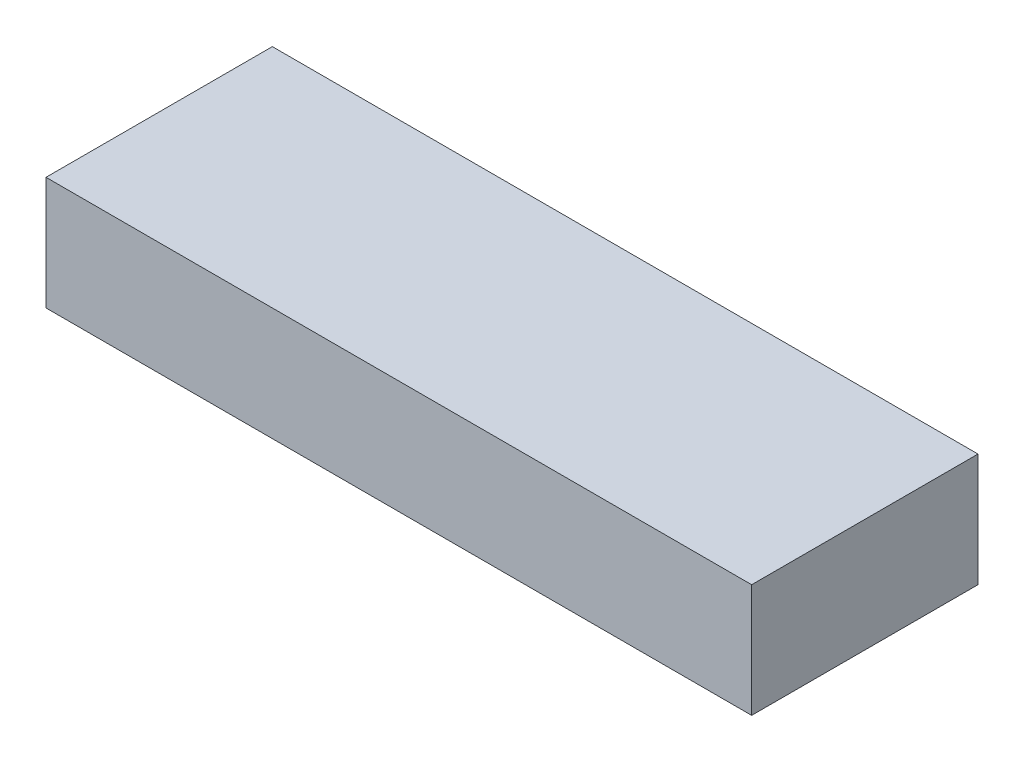
ISO-10303-21;
HEADER;
FILE_DESCRIPTION(('STEP AP214'),'2;1');
FILE_NAME('part.step','',(''),(''),'','','');
FILE_SCHEMA(('AUTOMOTIVE_DESIGN { 1 0 10303 214 1 1 1 1 }'));
ENDSEC;
DATA;
#1=APPLICATION_CONTEXT('core data for automotive mechanical design processes');
#2=APPLICATION_PROTOCOL_DEFINITION('international standard','automotive_design',2000,#1);
#3=PRODUCT_CONTEXT('',#1,'mechanical');
#4=PRODUCT('Part','Part','',(#3));
#5=PRODUCT_RELATED_PRODUCT_CATEGORY('part','',(#4));
#6=PRODUCT_DEFINITION_FORMATION('','',#4);
#7=PRODUCT_DEFINITION_CONTEXT('part definition',#1,'design');
#8=PRODUCT_DEFINITION('design','',#6,#7);
#9=PRODUCT_DEFINITION_SHAPE('','',#8);
#10=(LENGTH_UNIT() NAMED_UNIT(*) SI_UNIT(.MILLI.,.METRE.));
#11=(NAMED_UNIT(*) PLANE_ANGLE_UNIT() SI_UNIT($,.RADIAN.));
#12=(NAMED_UNIT(*) SI_UNIT($,.STERADIAN.) SOLID_ANGLE_UNIT());
#13=UNCERTAINTY_MEASURE_WITH_UNIT(LENGTH_MEASURE(1.E-05),#10,'distance_accuracy_value','');
#14=(GEOMETRIC_REPRESENTATION_CONTEXT(3) GLOBAL_UNCERTAINTY_ASSIGNED_CONTEXT((#13)) GLOBAL_UNIT_ASSIGNED_CONTEXT((#10,
#11,#12)) REPRESENTATION_CONTEXT('',''));
#15=CARTESIAN_POINT('',(0.,0.,0.));
#16=DIRECTION('',(0.,0.,1.));
#17=DIRECTION('',(1.,0.,0.));
#18=AXIS2_PLACEMENT_3D('',#15,#16,#17);
#19=CARTESIAN_POINT('',(-53.,17.,-17.000000036));
#20=DIRECTION('',(1.,0.,0.));
#21=DIRECTION('',(0.,0.,-1.));
#22=AXIS2_PLACEMENT_3D('',#19,#20,#21);
#23=PLANE('',#22);
#24=DIRECTION('',(0.,0.,1.));
#25=VECTOR('',#24,1.);
#26=CARTESIAN_POINT('',(-53.,0.,-17.000000036));
#27=LINE('',#26,#25);
#28=CARTESIAN_POINT('',(-53.,0.,-17.000000036));
#29=VERTEX_POINT('',#28);
#30=CARTESIAN_POINT('',(-53.,0.,17.000000036));
#31=VERTEX_POINT('',#30);
#32=EDGE_CURVE('E102',#29,#31,#27,.T.);
#33=ORIENTED_EDGE('',*,*,#32,.T.);
#34=DIRECTION('',(0.,-1.,0.));
#35=VECTOR('',#34,1.);
#36=CARTESIAN_POINT('',(-53.,17.,17.000000036));
#37=LINE('',#36,#35);
#38=CARTESIAN_POINT('',(-53.,17.,17.000000036));
#39=VERTEX_POINT('',#38);
#40=EDGE_CURVE('E11',#39,#31,#37,.T.);
#41=ORIENTED_EDGE('',*,*,#40,.F.);
#42=DIRECTION('',(0.,0.,1.));
#43=VECTOR('',#42,1.);
#44=CARTESIAN_POINT('',(-53.,17.,-17.000000036));
#45=LINE('',#44,#43);
#46=CARTESIAN_POINT('',(-53.,17.,-17.000000036));
#47=VERTEX_POINT('',#46);
#48=EDGE_CURVE('E90',#47,#39,#45,.T.);
#49=ORIENTED_EDGE('',*,*,#48,.F.);
#50=DIRECTION('',(0.,-1.,0.));
#51=VECTOR('',#50,1.);
#52=CARTESIAN_POINT('',(-53.,17.,-17.000000036));
#53=LINE('',#52,#51);
#54=EDGE_CURVE('E98',#47,#29,#53,.T.);
#55=ORIENTED_EDGE('',*,*,#54,.T.);
#56=EDGE_LOOP('',(#33,#41,#49,#55));
#57=FACE_BOUND('',#56,.T.);
#58=ADVANCED_FACE('F39',(#57),#23,.F.);
#59=CARTESIAN_POINT('',(-53.,17.,17.000000036));
#60=DIRECTION('',(0.,0.,-1.));
#61=DIRECTION('',(-1.,0.,0.));
#62=AXIS2_PLACEMENT_3D('',#59,#60,#61);
#63=PLANE('',#62);
#64=DIRECTION('',(1.,0.,0.));
#65=VECTOR('',#64,1.);
#66=CARTESIAN_POINT('',(-53.,0.,17.000000036));
#67=LINE('',#66,#65);
#68=CARTESIAN_POINT('',(53.,0.,17.000000036));
#69=VERTEX_POINT('',#68);
#70=EDGE_CURVE('E94',#31,#69,#67,.T.);
#71=ORIENTED_EDGE('',*,*,#70,.T.);
#72=DIRECTION('',(0.,-1.,0.));
#73=VECTOR('',#72,1.);
#74=CARTESIAN_POINT('',(53.,17.,17.000000036));
#75=LINE('',#74,#73);
#76=CARTESIAN_POINT('',(53.,17.,17.000000036));
#77=VERTEX_POINT('',#76);
#78=EDGE_CURVE('E47',#77,#69,#75,.T.);
#79=ORIENTED_EDGE('',*,*,#78,.F.);
#80=DIRECTION('',(1.,0.,0.));
#81=VECTOR('',#80,1.);
#82=CARTESIAN_POINT('',(-53.,17.,17.000000036));
#83=LINE('',#82,#81);
#84=EDGE_CURVE('E85',#39,#77,#83,.T.);
#85=ORIENTED_EDGE('',*,*,#84,.F.);
#86=ORIENTED_EDGE('',*,*,#40,.T.);
#87=EDGE_LOOP('',(#71,#79,#85,#86));
#88=FACE_BOUND('',#87,.T.);
#89=ADVANCED_FACE('F93',(#88),#63,.F.);
#90=CARTESIAN_POINT('',(53.,17.,-17.000000036));
#91=DIRECTION('',(-1.,0.,0.));
#92=DIRECTION('',(0.,0.,1.));
#93=AXIS2_PLACEMENT_3D('',#90,#91,#92);
#94=PLANE('',#93);
#95=DIRECTION('',(0.,0.,-1.));
#96=VECTOR('',#95,1.);
#97=CARTESIAN_POINT('',(53.,0.,-17.000000036));
#98=LINE('',#97,#96);
#99=CARTESIAN_POINT('',(53.,0.,-17.000000036));
#100=VERTEX_POINT('',#99);
#101=EDGE_CURVE('E72',#69,#100,#98,.T.);
#102=ORIENTED_EDGE('',*,*,#101,.T.);
#103=DIRECTION('',(0.,-1.,0.));
#104=VECTOR('',#103,1.);
#105=CARTESIAN_POINT('',(53.,17.,-17.000000036));
#106=LINE('',#105,#104);
#107=CARTESIAN_POINT('',(53.,17.,-17.000000036));
#108=VERTEX_POINT('',#107);
#109=EDGE_CURVE('E95',#108,#100,#106,.T.);
#110=ORIENTED_EDGE('',*,*,#109,.F.);
#111=DIRECTION('',(0.,0.,-1.));
#112=VECTOR('',#111,1.);
#113=CARTESIAN_POINT('',(53.,17.,-17.000000036));
#114=LINE('',#113,#112);
#115=EDGE_CURVE('E88',#77,#108,#114,.T.);
#116=ORIENTED_EDGE('',*,*,#115,.F.);
#117=ORIENTED_EDGE('',*,*,#78,.T.);
#118=EDGE_LOOP('',(#102,#110,#116,#117));
#119=FACE_BOUND('',#118,.T.);
#120=ADVANCED_FACE('F96',(#119),#94,.F.);
#121=CARTESIAN_POINT('',(-53.,17.,-17.000000036));
#122=DIRECTION('',(0.,0.,1.));
#123=DIRECTION('',(1.,0.,0.));
#124=AXIS2_PLACEMENT_3D('',#121,#122,#123);
#125=PLANE('',#124);
#126=DIRECTION('',(-1.,0.,0.));
#127=VECTOR('',#126,1.);
#128=CARTESIAN_POINT('',(-53.,0.,-17.000000036));
#129=LINE('',#128,#127);
#130=EDGE_CURVE('E78',#100,#29,#129,.T.);
#131=ORIENTED_EDGE('',*,*,#130,.T.);
#132=ORIENTED_EDGE('',*,*,#54,.F.);
#133=DIRECTION('',(-1.,0.,0.));
#134=VECTOR('',#133,1.);
#135=CARTESIAN_POINT('',(-53.,17.,-17.000000036));
#136=LINE('',#135,#134);
#137=EDGE_CURVE('E55',#108,#47,#136,.T.);
#138=ORIENTED_EDGE('',*,*,#137,.F.);
#139=ORIENTED_EDGE('',*,*,#109,.T.);
#140=EDGE_LOOP('',(#131,#132,#138,#139));
#141=FACE_BOUND('',#140,.T.);
#142=ADVANCED_FACE('F109',(#141),#125,.F.);
#143=CARTESIAN_POINT('',(0.,17.,0.));
#144=DIRECTION('',(0.,1.,0.));
#145=DIRECTION('',(0.,0.,1.));
#146=AXIS2_PLACEMENT_3D('',#143,#144,#145);
#147=PLANE('',#146);
#148=ORIENTED_EDGE('',*,*,#48,.T.);
#149=ORIENTED_EDGE('',*,*,#84,.T.);
#150=ORIENTED_EDGE('',*,*,#115,.T.);
#151=ORIENTED_EDGE('',*,*,#137,.T.);
#152=EDGE_LOOP('',(#148,#149,#150,#151));
#153=FACE_BOUND('',#152,.T.);
#154=ADVANCED_FACE('F86',(#153),#147,.T.);
#155=CARTESIAN_POINT('',(0.,0.,0.));
#156=DIRECTION('',(0.,1.,0.));
#157=DIRECTION('',(0.,0.,1.));
#158=AXIS2_PLACEMENT_3D('',#155,#156,#157);
#159=PLANE('',#158);
#160=ORIENTED_EDGE('',*,*,#32,.F.);
#161=ORIENTED_EDGE('',*,*,#130,.F.);
#162=ORIENTED_EDGE('',*,*,#101,.F.);
#163=ORIENTED_EDGE('',*,*,#70,.F.);
#164=EDGE_LOOP('',(#160,#161,#162,#163));
#165=FACE_BOUND('',#164,.T.);
#166=ADVANCED_FACE('F112',(#165),#159,.F.);
#167=CLOSED_SHELL('',(#58,#89,#120,#142,#154,#166));
#168=MANIFOLD_SOLID_BREP('B2',#167);
#169=ADVANCED_BREP_SHAPE_REPRESENTATION('',(#18,#168),#14);
#170=SHAPE_DEFINITION_REPRESENTATION(#9,#169);
ENDSEC;
END-ISO-10303-21;
